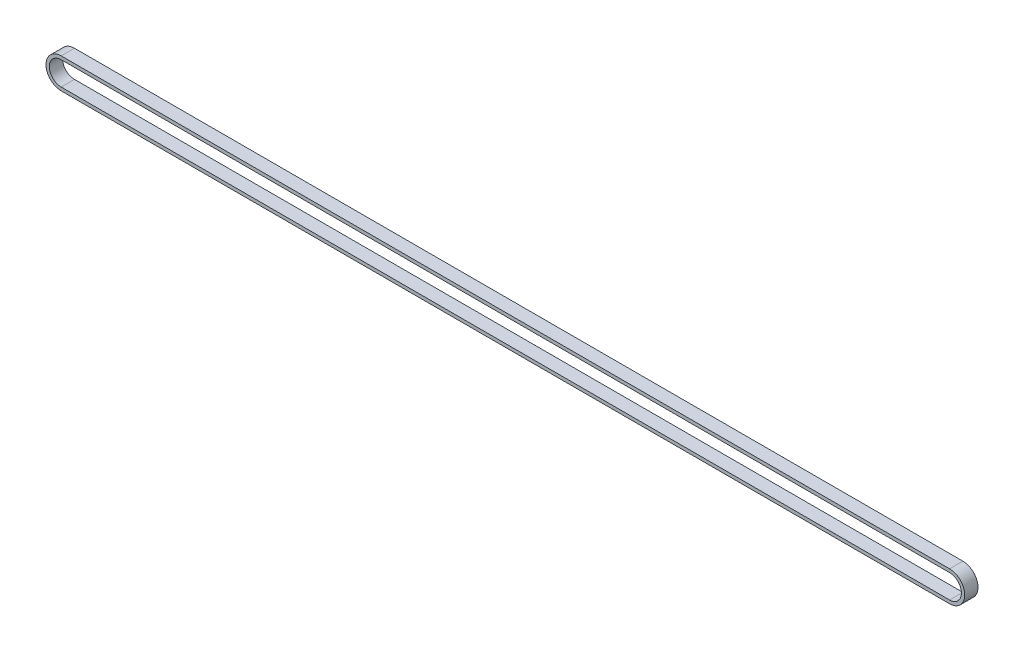
ISO-10303-21;
HEADER;
FILE_DESCRIPTION(('STEP AP214'),'2;1');
FILE_NAME('part.step','',(''),(''),'','','');
FILE_SCHEMA(('AUTOMOTIVE_DESIGN { 1 0 10303 214 1 1 1 1 }'));
ENDSEC;
DATA;
#1=APPLICATION_CONTEXT('core data for automotive mechanical design processes');
#2=APPLICATION_PROTOCOL_DEFINITION('international standard','automotive_design',2000,#1);
#3=PRODUCT_CONTEXT('',#1,'mechanical');
#4=PRODUCT('Part','Part','',(#3));
#5=PRODUCT_RELATED_PRODUCT_CATEGORY('part','',(#4));
#6=PRODUCT_DEFINITION_FORMATION('','',#4);
#7=PRODUCT_DEFINITION_CONTEXT('part definition',#1,'design');
#8=PRODUCT_DEFINITION('design','',#6,#7);
#9=PRODUCT_DEFINITION_SHAPE('','',#8);
#10=(LENGTH_UNIT() NAMED_UNIT(*) SI_UNIT(.MILLI.,.METRE.));
#11=(NAMED_UNIT(*) PLANE_ANGLE_UNIT() SI_UNIT($,.RADIAN.));
#12=(NAMED_UNIT(*) SI_UNIT($,.STERADIAN.) SOLID_ANGLE_UNIT());
#13=UNCERTAINTY_MEASURE_WITH_UNIT(LENGTH_MEASURE(1.E-05),#10,'distance_accuracy_value','');
#14=(GEOMETRIC_REPRESENTATION_CONTEXT(3) GLOBAL_UNCERTAINTY_ASSIGNED_CONTEXT((#13)) GLOBAL_UNIT_ASSIGNED_CONTEXT((#10,
#11,#12)) REPRESENTATION_CONTEXT('',''));
#15=CARTESIAN_POINT('',(0.,0.,0.));
#16=DIRECTION('',(0.,0.,1.));
#17=DIRECTION('',(1.,0.,0.));
#18=AXIS2_PLACEMENT_3D('',#15,#16,#17);
#19=CARTESIAN_POINT('',(-200.8,0.,3.));
#20=DIRECTION('',(0.,0.,1.));
#21=DIRECTION('',(1.,0.,0.));
#22=AXIS2_PLACEMENT_3D('',#19,#20,#21);
#23=PLANE('',#22);
#24=CARTESIAN_POINT('',(-200.8,0.,3.));
#25=DIRECTION('',(0.,0.,1.));
#26=DIRECTION('',(1.,0.,0.));
#27=AXIS2_PLACEMENT_3D('',#24,#25,#26);
#28=CIRCLE('',#27,6.85);
#29=CARTESIAN_POINT('',(-200.8,6.85,3.));
#30=VERTEX_POINT('',#29);
#31=CARTESIAN_POINT('',(-200.8,-6.85,3.));
#32=VERTEX_POINT('',#31);
#33=EDGE_CURVE('E176',#30,#32,#28,.T.);
#34=ORIENTED_EDGE('',*,*,#33,.T.);
#35=DIRECTION('',(1.,0.,0.));
#36=VECTOR('',#35,1.);
#37=CARTESIAN_POINT('',(-200.8,-6.85,3.));
#38=LINE('',#37,#36);
#39=CARTESIAN_POINT('',(200.8,-6.84999999999993,3.));
#40=VERTEX_POINT('',#39);
#41=EDGE_CURVE('E179',#32,#40,#38,.T.);
#42=ORIENTED_EDGE('',*,*,#41,.T.);
#43=CARTESIAN_POINT('',(200.8,0.,3.));
#44=DIRECTION('',(0.,0.,1.));
#45=DIRECTION('',(1.,0.,0.));
#46=AXIS2_PLACEMENT_3D('',#43,#44,#45);
#47=CIRCLE('',#46,6.85);
#48=CARTESIAN_POINT('',(200.8,6.85000000000007,3.));
#49=VERTEX_POINT('',#48);
#50=EDGE_CURVE('E182',#40,#49,#47,.T.);
#51=ORIENTED_EDGE('',*,*,#50,.T.);
#52=DIRECTION('',(1.,0.,0.));
#53=VECTOR('',#52,1.);
#54=CARTESIAN_POINT('',(-200.8,6.85,3.));
#55=LINE('',#54,#53);
#56=EDGE_CURVE('E185',#30,#49,#55,.T.);
#57=ORIENTED_EDGE('',*,*,#56,.F.);
#58=EDGE_LOOP('',(#34,#42,#51,#57));
#59=FACE_BOUND('',#58,.T.);
#60=DIRECTION('',(1.,0.,0.));
#61=VECTOR('',#60,1.);
#62=CARTESIAN_POINT('',(-200.8,-5.35,3.));
#63=LINE('',#62,#61);
#64=CARTESIAN_POINT('',(-200.8,-5.35,3.));
#65=VERTEX_POINT('',#64);
#66=CARTESIAN_POINT('',(200.8,-5.34999999999993,3.));
#67=VERTEX_POINT('',#66);
#68=EDGE_CURVE('E140',#65,#67,#63,.T.);
#69=ORIENTED_EDGE('',*,*,#68,.F.);
#70=CARTESIAN_POINT('',(-200.8,0.,3.));
#71=DIRECTION('',(0.,0.,1.));
#72=DIRECTION('',(1.,0.,0.));
#73=AXIS2_PLACEMENT_3D('',#70,#71,#72);
#74=CIRCLE('',#73,5.35);
#75=CARTESIAN_POINT('',(-200.8,5.35,3.));
#76=VERTEX_POINT('',#75);
#77=EDGE_CURVE('E132',#76,#65,#74,.T.);
#78=ORIENTED_EDGE('',*,*,#77,.F.);
#79=DIRECTION('',(1.,0.,0.));
#80=VECTOR('',#79,1.);
#81=CARTESIAN_POINT('',(-200.8,5.35,3.));
#82=LINE('',#81,#80);
#83=CARTESIAN_POINT('',(200.8,5.35000000000007,3.));
#84=VERTEX_POINT('',#83);
#85=EDGE_CURVE('E157',#76,#84,#82,.T.);
#86=ORIENTED_EDGE('',*,*,#85,.T.);
#87=CARTESIAN_POINT('',(200.8,0.,3.));
#88=DIRECTION('',(0.,0.,1.));
#89=DIRECTION('',(1.,0.,0.));
#90=AXIS2_PLACEMENT_3D('',#87,#88,#89);
#91=CIRCLE('',#90,5.35);
#92=EDGE_CURVE('E152',#67,#84,#91,.T.);
#93=ORIENTED_EDGE('',*,*,#92,.F.);
#94=EDGE_LOOP('',(#69,#78,#86,#93));
#95=FACE_BOUND('',#94,.T.);
#96=ADVANCED_FACE('F62',(#59,#95),#23,.T.);
#97=CARTESIAN_POINT('',(-200.8,0.,-3.));
#98=DIRECTION('',(0.,0.,1.));
#99=DIRECTION('',(1.,0.,0.));
#100=AXIS2_PLACEMENT_3D('',#97,#98,#99);
#101=PLANE('',#100);
#102=CARTESIAN_POINT('',(-200.8,0.,-3.));
#103=DIRECTION('',(0.,0.,1.));
#104=DIRECTION('',(1.,0.,0.));
#105=AXIS2_PLACEMENT_3D('',#102,#103,#104);
#106=CIRCLE('',#105,6.85);
#107=CARTESIAN_POINT('',(-200.8,6.85,-3.));
#108=VERTEX_POINT('',#107);
#109=CARTESIAN_POINT('',(-200.8,-6.85,-3.));
#110=VERTEX_POINT('',#109);
#111=EDGE_CURVE('E148',#108,#110,#106,.T.);
#112=ORIENTED_EDGE('',*,*,#111,.F.);
#113=DIRECTION('',(1.,0.,0.));
#114=VECTOR('',#113,1.);
#115=CARTESIAN_POINT('',(-200.8,6.85,-3.));
#116=LINE('',#115,#114);
#117=CARTESIAN_POINT('',(200.8,6.85000000000007,-3.));
#118=VERTEX_POINT('',#117);
#119=EDGE_CURVE('E180',#108,#118,#116,.T.);
#120=ORIENTED_EDGE('',*,*,#119,.T.);
#121=CARTESIAN_POINT('',(200.8,0.,-3.));
#122=DIRECTION('',(0.,0.,1.));
#123=DIRECTION('',(1.,0.,0.));
#124=AXIS2_PLACEMENT_3D('',#121,#122,#123);
#125=CIRCLE('',#124,6.85);
#126=CARTESIAN_POINT('',(200.8,-6.84999999999993,-3.));
#127=VERTEX_POINT('',#126);
#128=EDGE_CURVE('E195',#127,#118,#125,.T.);
#129=ORIENTED_EDGE('',*,*,#128,.F.);
#130=DIRECTION('',(1.,0.,0.));
#131=VECTOR('',#130,1.);
#132=CARTESIAN_POINT('',(-200.8,-6.85,-3.));
#133=LINE('',#132,#131);
#134=EDGE_CURVE('E192',#110,#127,#133,.T.);
#135=ORIENTED_EDGE('',*,*,#134,.F.);
#136=EDGE_LOOP('',(#112,#120,#129,#135));
#137=FACE_BOUND('',#136,.T.);
#138=CARTESIAN_POINT('',(-200.8,0.,-3.));
#139=DIRECTION('',(0.,0.,1.));
#140=DIRECTION('',(1.,0.,0.));
#141=AXIS2_PLACEMENT_3D('',#138,#139,#140);
#142=CIRCLE('',#141,5.35);
#143=CARTESIAN_POINT('',(-200.8,5.35,-3.));
#144=VERTEX_POINT('',#143);
#145=CARTESIAN_POINT('',(-200.8,-5.35,-3.));
#146=VERTEX_POINT('',#145);
#147=EDGE_CURVE('E85',#144,#146,#142,.T.);
#148=ORIENTED_EDGE('',*,*,#147,.T.);
#149=DIRECTION('',(1.,0.,0.));
#150=VECTOR('',#149,1.);
#151=CARTESIAN_POINT('',(-200.8,-5.35,-3.));
#152=LINE('',#151,#150);
#153=CARTESIAN_POINT('',(200.8,-5.34999999999993,-3.));
#154=VERTEX_POINT('',#153);
#155=EDGE_CURVE('E147',#146,#154,#152,.T.);
#156=ORIENTED_EDGE('',*,*,#155,.T.);
#157=CARTESIAN_POINT('',(200.8,0.,-3.));
#158=DIRECTION('',(0.,0.,1.));
#159=DIRECTION('',(1.,0.,0.));
#160=AXIS2_PLACEMENT_3D('',#157,#158,#159);
#161=CIRCLE('',#160,5.35);
#162=CARTESIAN_POINT('',(200.8,5.35000000000007,-3.));
#163=VERTEX_POINT('',#162);
#164=EDGE_CURVE('E165',#154,#163,#161,.T.);
#165=ORIENTED_EDGE('',*,*,#164,.T.);
#166=DIRECTION('',(1.,0.,0.));
#167=VECTOR('',#166,1.);
#168=CARTESIAN_POINT('',(-200.8,5.35,-3.));
#169=LINE('',#168,#167);
#170=EDGE_CURVE('E141',#144,#163,#169,.T.);
#171=ORIENTED_EDGE('',*,*,#170,.F.);
#172=EDGE_LOOP('',(#148,#156,#165,#171));
#173=FACE_BOUND('',#172,.T.);
#174=ADVANCED_FACE('F215',(#137,#173),#101,.F.);
#175=CARTESIAN_POINT('',(-200.8,0.,3.));
#176=DIRECTION('',(0.,0.,-1.));
#177=DIRECTION('',(-1.,0.,0.));
#178=AXIS2_PLACEMENT_3D('',#175,#176,#177);
#179=CYLINDRICAL_SURFACE('',#178,6.85);
#180=ORIENTED_EDGE('',*,*,#111,.T.);
#181=DIRECTION('',(0.,0.,-1.));
#182=VECTOR('',#181,1.);
#183=CARTESIAN_POINT('',(-200.8,-6.85,3.));
#184=LINE('',#183,#182);
#185=EDGE_CURVE('E12',#32,#110,#184,.T.);
#186=ORIENTED_EDGE('',*,*,#185,.F.);
#187=ORIENTED_EDGE('',*,*,#33,.F.);
#188=DIRECTION('',(0.,0.,-1.));
#189=VECTOR('',#188,1.);
#190=CARTESIAN_POINT('',(-200.8,6.85,3.));
#191=LINE('',#190,#189);
#192=EDGE_CURVE('E189',#30,#108,#191,.T.);
#193=ORIENTED_EDGE('',*,*,#192,.T.);
#194=EDGE_LOOP('',(#180,#186,#187,#193));
#195=FACE_BOUND('',#194,.T.);
#196=ADVANCED_FACE('F64',(#195),#179,.T.);
#197=CARTESIAN_POINT('',(-200.8,-6.85,3.));
#198=DIRECTION('',(0.,1.,0.));
#199=DIRECTION('',(-1.,0.,0.));
#200=AXIS2_PLACEMENT_3D('',#197,#198,#199);
#201=PLANE('',#200);
#202=ORIENTED_EDGE('',*,*,#134,.T.);
#203=DIRECTION('',(0.,0.,-1.));
#204=VECTOR('',#203,1.);
#205=CARTESIAN_POINT('',(200.8,-6.84999999999993,3.));
#206=LINE('',#205,#204);
#207=EDGE_CURVE('E70',#40,#127,#206,.T.);
#208=ORIENTED_EDGE('',*,*,#207,.F.);
#209=ORIENTED_EDGE('',*,*,#41,.F.);
#210=ORIENTED_EDGE('',*,*,#185,.T.);
#211=EDGE_LOOP('',(#202,#208,#209,#210));
#212=FACE_BOUND('',#211,.T.);
#213=ADVANCED_FACE('F224',(#212),#201,.F.);
#214=CARTESIAN_POINT('',(200.8,0.,3.));
#215=DIRECTION('',(0.,0.,-1.));
#216=DIRECTION('',(-1.,0.,0.));
#217=AXIS2_PLACEMENT_3D('',#214,#215,#216);
#218=CYLINDRICAL_SURFACE('',#217,6.85);
#219=ORIENTED_EDGE('',*,*,#128,.T.);
#220=DIRECTION('',(0.,0.,-1.));
#221=VECTOR('',#220,1.);
#222=CARTESIAN_POINT('',(200.8,6.85000000000007,3.));
#223=LINE('',#222,#221);
#224=EDGE_CURVE('E203',#49,#118,#223,.T.);
#225=ORIENTED_EDGE('',*,*,#224,.F.);
#226=ORIENTED_EDGE('',*,*,#50,.F.);
#227=ORIENTED_EDGE('',*,*,#207,.T.);
#228=EDGE_LOOP('',(#219,#225,#226,#227));
#229=FACE_BOUND('',#228,.T.);
#230=ADVANCED_FACE('F210',(#229),#218,.T.);
#231=CARTESIAN_POINT('',(-200.8,6.85,3.));
#232=DIRECTION('',(0.,1.,0.));
#233=DIRECTION('',(-1.,0.,0.));
#234=AXIS2_PLACEMENT_3D('',#231,#232,#233);
#235=PLANE('',#234);
#236=ORIENTED_EDGE('',*,*,#119,.F.);
#237=ORIENTED_EDGE('',*,*,#192,.F.);
#238=ORIENTED_EDGE('',*,*,#56,.T.);
#239=ORIENTED_EDGE('',*,*,#224,.T.);
#240=EDGE_LOOP('',(#236,#237,#238,#239));
#241=FACE_BOUND('',#240,.T.);
#242=ADVANCED_FACE('F219',(#241),#235,.T.);
#243=CARTESIAN_POINT('',(-200.8,0.,3.));
#244=DIRECTION('',(0.,0.,-1.));
#245=DIRECTION('',(-1.,0.,0.));
#246=AXIS2_PLACEMENT_3D('',#243,#244,#245);
#247=CYLINDRICAL_SURFACE('',#246,5.35);
#248=ORIENTED_EDGE('',*,*,#147,.F.);
#249=DIRECTION('',(0.,0.,-1.));
#250=VECTOR('',#249,1.);
#251=CARTESIAN_POINT('',(-200.8,5.35,3.));
#252=LINE('',#251,#250);
#253=EDGE_CURVE('E136',#76,#144,#252,.T.);
#254=ORIENTED_EDGE('',*,*,#253,.F.);
#255=ORIENTED_EDGE('',*,*,#77,.T.);
#256=DIRECTION('',(0.,0.,-1.));
#257=VECTOR('',#256,1.);
#258=CARTESIAN_POINT('',(-200.8,-5.35,3.));
#259=LINE('',#258,#257);
#260=EDGE_CURVE('E135',#65,#146,#259,.T.);
#261=ORIENTED_EDGE('',*,*,#260,.T.);
#262=EDGE_LOOP('',(#248,#254,#255,#261));
#263=FACE_BOUND('',#262,.T.);
#264=ADVANCED_FACE('F134',(#263),#247,.F.);
#265=CARTESIAN_POINT('',(-200.8,-5.35,3.));
#266=DIRECTION('',(0.,1.,0.));
#267=DIRECTION('',(-1.,0.,0.));
#268=AXIS2_PLACEMENT_3D('',#265,#266,#267);
#269=PLANE('',#268);
#270=ORIENTED_EDGE('',*,*,#155,.F.);
#271=ORIENTED_EDGE('',*,*,#260,.F.);
#272=ORIENTED_EDGE('',*,*,#68,.T.);
#273=DIRECTION('',(0.,0.,-1.));
#274=VECTOR('',#273,1.);
#275=CARTESIAN_POINT('',(200.8,-5.34999999999993,3.));
#276=LINE('',#275,#274);
#277=EDGE_CURVE('E149',#67,#154,#276,.T.);
#278=ORIENTED_EDGE('',*,*,#277,.T.);
#279=EDGE_LOOP('',(#270,#271,#272,#278));
#280=FACE_BOUND('',#279,.T.);
#281=ADVANCED_FACE('F144',(#280),#269,.T.);
#282=CARTESIAN_POINT('',(200.8,0.,3.));
#283=DIRECTION('',(0.,0.,-1.));
#284=DIRECTION('',(-1.,0.,0.));
#285=AXIS2_PLACEMENT_3D('',#282,#283,#284);
#286=CYLINDRICAL_SURFACE('',#285,5.35);
#287=ORIENTED_EDGE('',*,*,#164,.F.);
#288=ORIENTED_EDGE('',*,*,#277,.F.);
#289=ORIENTED_EDGE('',*,*,#92,.T.);
#290=DIRECTION('',(0.,0.,-1.));
#291=VECTOR('',#290,1.);
#292=CARTESIAN_POINT('',(200.8,5.35000000000007,3.));
#293=LINE('',#292,#291);
#294=EDGE_CURVE('E77',#84,#163,#293,.T.);
#295=ORIENTED_EDGE('',*,*,#294,.T.);
#296=EDGE_LOOP('',(#287,#288,#289,#295));
#297=FACE_BOUND('',#296,.T.);
#298=ADVANCED_FACE('F263',(#297),#286,.F.);
#299=CARTESIAN_POINT('',(-200.8,5.35,3.));
#300=DIRECTION('',(0.,1.,0.));
#301=DIRECTION('',(-1.,0.,0.));
#302=AXIS2_PLACEMENT_3D('',#299,#300,#301);
#303=PLANE('',#302);
#304=ORIENTED_EDGE('',*,*,#170,.T.);
#305=ORIENTED_EDGE('',*,*,#294,.F.);
#306=ORIENTED_EDGE('',*,*,#85,.F.);
#307=ORIENTED_EDGE('',*,*,#253,.T.);
#308=EDGE_LOOP('',(#304,#305,#306,#307));
#309=FACE_BOUND('',#308,.T.);
#310=ADVANCED_FACE('F267',(#309),#303,.F.);
#311=CLOSED_SHELL('',(#96,#174,#196,#213,#230,#242,#264,#281,#298,#310));
#312=MANIFOLD_SOLID_BREP('B2',#311);
#313=ADVANCED_BREP_SHAPE_REPRESENTATION('',(#18,#312),#14);
#314=SHAPE_DEFINITION_REPRESENTATION(#9,#313);
ENDSEC;
END-ISO-10303-21;
